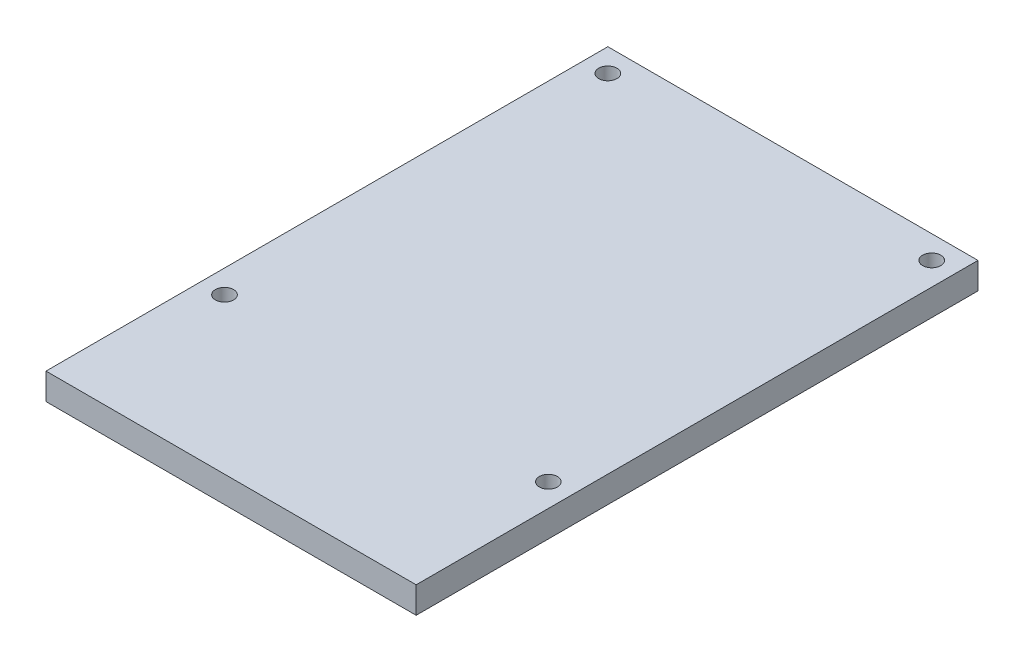
ISO-10303-21;
HEADER;
FILE_DESCRIPTION(('STEP AP214'),'2;1');
FILE_NAME('part.step','',(''),(''),'','','');
FILE_SCHEMA(('AUTOMOTIVE_DESIGN { 1 0 10303 214 1 1 1 1 }'));
ENDSEC;
DATA;
#1=APPLICATION_CONTEXT('core data for automotive mechanical design processes');
#2=APPLICATION_PROTOCOL_DEFINITION('international standard','automotive_design',2000,#1);
#3=PRODUCT_CONTEXT('',#1,'mechanical');
#4=PRODUCT('Part','Part','',(#3));
#5=PRODUCT_RELATED_PRODUCT_CATEGORY('part','',(#4));
#6=PRODUCT_DEFINITION_FORMATION('','',#4);
#7=PRODUCT_DEFINITION_CONTEXT('part definition',#1,'design');
#8=PRODUCT_DEFINITION('design','',#6,#7);
#9=PRODUCT_DEFINITION_SHAPE('','',#8);
#10=(LENGTH_UNIT() NAMED_UNIT(*) SI_UNIT(.MILLI.,.METRE.));
#11=(NAMED_UNIT(*) PLANE_ANGLE_UNIT() SI_UNIT($,.RADIAN.));
#12=(NAMED_UNIT(*) SI_UNIT($,.STERADIAN.) SOLID_ANGLE_UNIT());
#13=UNCERTAINTY_MEASURE_WITH_UNIT(LENGTH_MEASURE(1.E-05),#10,'distance_accuracy_value','');
#14=(GEOMETRIC_REPRESENTATION_CONTEXT(3) GLOBAL_UNCERTAINTY_ASSIGNED_CONTEXT((#13)) GLOBAL_UNIT_ASSIGNED_CONTEXT((#10,
#11,#12)) REPRESENTATION_CONTEXT('',''));
#15=CARTESIAN_POINT('',(0.,0.,0.));
#16=DIRECTION('',(0.,0.,1.));
#17=DIRECTION('',(1.,0.,0.));
#18=AXIS2_PLACEMENT_3D('',#15,#16,#17);
#19=CARTESIAN_POINT('',(0.,4.,0.));
#20=DIRECTION('',(1.,0.,0.));
#21=DIRECTION('',(0.,0.,-1.));
#22=AXIS2_PLACEMENT_3D('',#19,#20,#21);
#23=PLANE('',#22);
#24=DIRECTION('',(0.,0.,1.));
#25=VECTOR('',#24,1.);
#26=CARTESIAN_POINT('',(0.,0.,0.));
#27=LINE('',#26,#25);
#28=CARTESIAN_POINT('',(0.,0.,-85.));
#29=VERTEX_POINT('',#28);
#30=CARTESIAN_POINT('',(0.,0.,0.));
#31=VERTEX_POINT('',#30);
#32=EDGE_CURVE('E96',#29,#31,#27,.T.);
#33=ORIENTED_EDGE('',*,*,#32,.T.);
#34=DIRECTION('',(0.,-1.,0.));
#35=VECTOR('',#34,1.);
#36=CARTESIAN_POINT('',(0.,4.,0.));
#37=LINE('',#36,#35);
#38=CARTESIAN_POINT('',(0.,4.,0.));
#39=VERTEX_POINT('',#38);
#40=EDGE_CURVE('E11',#39,#31,#37,.T.);
#41=ORIENTED_EDGE('',*,*,#40,.F.);
#42=DIRECTION('',(0.,0.,1.));
#43=VECTOR('',#42,1.);
#44=CARTESIAN_POINT('',(0.,4.,0.));
#45=LINE('',#44,#43);
#46=CARTESIAN_POINT('',(0.,4.,-85.));
#47=VERTEX_POINT('',#46);
#48=EDGE_CURVE('E84',#47,#39,#45,.T.);
#49=ORIENTED_EDGE('',*,*,#48,.F.);
#50=DIRECTION('',(0.,-1.,0.));
#51=VECTOR('',#50,1.);
#52=CARTESIAN_POINT('',(0.,4.,-85.));
#53=LINE('',#52,#51);
#54=EDGE_CURVE('E92',#47,#29,#53,.T.);
#55=ORIENTED_EDGE('',*,*,#54,.T.);
#56=EDGE_LOOP('',(#33,#41,#49,#55));
#57=FACE_BOUND('',#56,.T.);
#58=ADVANCED_FACE('F33',(#57),#23,.F.);
#59=CARTESIAN_POINT('',(0.,4.,0.));
#60=DIRECTION('',(0.,0.,-1.));
#61=DIRECTION('',(-1.,0.,0.));
#62=AXIS2_PLACEMENT_3D('',#59,#60,#61);
#63=PLANE('',#62);
#64=DIRECTION('',(1.,0.,0.));
#65=VECTOR('',#64,1.);
#66=CARTESIAN_POINT('',(0.,0.,0.));
#67=LINE('',#66,#65);
#68=CARTESIAN_POINT('',(56.,0.,0.));
#69=VERTEX_POINT('',#68);
#70=EDGE_CURVE('E88',#31,#69,#67,.T.);
#71=ORIENTED_EDGE('',*,*,#70,.T.);
#72=DIRECTION('',(0.,-1.,0.));
#73=VECTOR('',#72,1.);
#74=CARTESIAN_POINT('',(56.,4.,0.));
#75=LINE('',#74,#73);
#76=CARTESIAN_POINT('',(56.,4.,0.));
#77=VERTEX_POINT('',#76);
#78=EDGE_CURVE('E41',#77,#69,#75,.T.);
#79=ORIENTED_EDGE('',*,*,#78,.F.);
#80=DIRECTION('',(1.,0.,0.));
#81=VECTOR('',#80,1.);
#82=CARTESIAN_POINT('',(0.,4.,0.));
#83=LINE('',#82,#81);
#84=EDGE_CURVE('E79',#39,#77,#83,.T.);
#85=ORIENTED_EDGE('',*,*,#84,.F.);
#86=ORIENTED_EDGE('',*,*,#40,.T.);
#87=EDGE_LOOP('',(#71,#79,#85,#86));
#88=FACE_BOUND('',#87,.T.);
#89=ADVANCED_FACE('F87',(#88),#63,.F.);
#90=CARTESIAN_POINT('',(56.,4.,0.));
#91=DIRECTION('',(-1.,0.,0.));
#92=DIRECTION('',(0.,0.,1.));
#93=AXIS2_PLACEMENT_3D('',#90,#91,#92);
#94=PLANE('',#93);
#95=DIRECTION('',(0.,0.,-1.));
#96=VECTOR('',#95,1.);
#97=CARTESIAN_POINT('',(56.,0.,0.));
#98=LINE('',#97,#96);
#99=CARTESIAN_POINT('',(56.,0.,-85.));
#100=VERTEX_POINT('',#99);
#101=EDGE_CURVE('E66',#69,#100,#98,.T.);
#102=ORIENTED_EDGE('',*,*,#101,.T.);
#103=DIRECTION('',(0.,-1.,0.));
#104=VECTOR('',#103,1.);
#105=CARTESIAN_POINT('',(56.,4.,-85.));
#106=LINE('',#105,#104);
#107=CARTESIAN_POINT('',(56.,4.,-85.));
#108=VERTEX_POINT('',#107);
#109=EDGE_CURVE('E89',#108,#100,#106,.T.);
#110=ORIENTED_EDGE('',*,*,#109,.F.);
#111=DIRECTION('',(0.,0.,-1.));
#112=VECTOR('',#111,1.);
#113=CARTESIAN_POINT('',(56.,4.,0.));
#114=LINE('',#113,#112);
#115=EDGE_CURVE('E82',#77,#108,#114,.T.);
#116=ORIENTED_EDGE('',*,*,#115,.F.);
#117=ORIENTED_EDGE('',*,*,#78,.T.);
#118=EDGE_LOOP('',(#102,#110,#116,#117));
#119=FACE_BOUND('',#118,.T.);
#120=ADVANCED_FACE('F90',(#119),#94,.F.);
#121=CARTESIAN_POINT('',(0.,4.,-85.));
#122=DIRECTION('',(0.,0.,1.));
#123=DIRECTION('',(1.,0.,0.));
#124=AXIS2_PLACEMENT_3D('',#121,#122,#123);
#125=PLANE('',#124);
#126=DIRECTION('',(-1.,0.,0.));
#127=VECTOR('',#126,1.);
#128=CARTESIAN_POINT('',(0.,0.,-85.));
#129=LINE('',#128,#127);
#130=EDGE_CURVE('E72',#100,#29,#129,.T.);
#131=ORIENTED_EDGE('',*,*,#130,.T.);
#132=ORIENTED_EDGE('',*,*,#54,.F.);
#133=DIRECTION('',(-1.,0.,0.));
#134=VECTOR('',#133,1.);
#135=CARTESIAN_POINT('',(0.,4.,-85.));
#136=LINE('',#135,#134);
#137=EDGE_CURVE('E49',#108,#47,#136,.T.);
#138=ORIENTED_EDGE('',*,*,#137,.F.);
#139=ORIENTED_EDGE('',*,*,#109,.T.);
#140=EDGE_LOOP('',(#131,#132,#138,#139));
#141=FACE_BOUND('',#140,.T.);
#142=ADVANCED_FACE('F104',(#141),#125,.F.);
#143=CARTESIAN_POINT('',(0.,4.,0.));
#144=DIRECTION('',(0.,-1.,0.));
#145=DIRECTION('',(0.,0.,-1.));
#146=AXIS2_PLACEMENT_3D('',#143,#144,#145);
#147=PLANE('',#146);
#148=CARTESIAN_POINT('',(52.5,4.,-81.5));
#149=DIRECTION('',(0.,1.,0.));
#150=DIRECTION('',(0.,0.,1.));
#151=AXIS2_PLACEMENT_3D('',#148,#149,#150);
#152=CIRCLE('',#151,1.375);
#153=CARTESIAN_POINT('',(52.5,4.,-80.125));
#154=VERTEX_POINT('',#153);
#155=EDGE_CURVE('E123',#154,#154,#152,.T.);
#156=ORIENTED_EDGE('',*,*,#155,.F.);
#157=EDGE_LOOP('',(#156));
#158=FACE_BOUND('',#157,.T.);
#159=CARTESIAN_POINT('',(3.5,4.,-23.5));
#160=DIRECTION('',(0.,1.,0.));
#161=DIRECTION('',(0.,0.,1.));
#162=AXIS2_PLACEMENT_3D('',#159,#160,#161);
#163=CIRCLE('',#162,1.375);
#164=CARTESIAN_POINT('',(3.5,4.,-22.125));
#165=VERTEX_POINT('',#164);
#166=EDGE_CURVE('E116',#165,#165,#163,.T.);
#167=ORIENTED_EDGE('',*,*,#166,.F.);
#168=EDGE_LOOP('',(#167));
#169=FACE_BOUND('',#168,.T.);
#170=CARTESIAN_POINT('',(52.5,4.,-23.5));
#171=DIRECTION('',(0.,1.,0.));
#172=DIRECTION('',(0.,0.,1.));
#173=AXIS2_PLACEMENT_3D('',#170,#171,#172);
#174=CIRCLE('',#173,1.375);
#175=CARTESIAN_POINT('',(52.5,4.,-22.125));
#176=VERTEX_POINT('',#175);
#177=EDGE_CURVE('E128',#176,#176,#174,.T.);
#178=ORIENTED_EDGE('',*,*,#177,.F.);
#179=EDGE_LOOP('',(#178));
#180=FACE_BOUND('',#179,.T.);
#181=CARTESIAN_POINT('',(3.5,4.,-81.5));
#182=DIRECTION('',(0.,1.,0.));
#183=DIRECTION('',(0.,0.,1.));
#184=AXIS2_PLACEMENT_3D('',#181,#182,#183);
#185=CIRCLE('',#184,1.375);
#186=CARTESIAN_POINT('',(3.5,4.,-80.125));
#187=VERTEX_POINT('',#186);
#188=EDGE_CURVE('E110',#187,#187,#185,.T.);
#189=ORIENTED_EDGE('',*,*,#188,.F.);
#190=EDGE_LOOP('',(#189));
#191=FACE_BOUND('',#190,.T.);
#192=ORIENTED_EDGE('',*,*,#48,.T.);
#193=ORIENTED_EDGE('',*,*,#84,.T.);
#194=ORIENTED_EDGE('',*,*,#115,.T.);
#195=ORIENTED_EDGE('',*,*,#137,.T.);
#196=EDGE_LOOP('',(#192,#193,#194,#195));
#197=FACE_BOUND('',#196,.T.);
#198=ADVANCED_FACE('F80',(#158,#169,#180,#191,#197),#147,.F.);
#199=CARTESIAN_POINT('',(0.,0.,0.));
#200=DIRECTION('',(0.,-1.,0.));
#201=DIRECTION('',(0.,0.,-1.));
#202=AXIS2_PLACEMENT_3D('',#199,#200,#201);
#203=PLANE('',#202);
#204=CARTESIAN_POINT('',(52.5,0.,-81.5));
#205=DIRECTION('',(0.,1.,0.));
#206=DIRECTION('',(0.,0.,1.));
#207=AXIS2_PLACEMENT_3D('',#204,#205,#206);
#208=CIRCLE('',#207,1.375);
#209=CARTESIAN_POINT('',(52.5,0.,-80.125));
#210=VERTEX_POINT('',#209);
#211=EDGE_CURVE('E113',#210,#210,#208,.T.);
#212=ORIENTED_EDGE('',*,*,#211,.T.);
#213=EDGE_LOOP('',(#212));
#214=FACE_BOUND('',#213,.T.);
#215=CARTESIAN_POINT('',(3.5,0.,-23.5));
#216=DIRECTION('',(0.,1.,0.));
#217=DIRECTION('',(0.,0.,1.));
#218=AXIS2_PLACEMENT_3D('',#215,#216,#217);
#219=CIRCLE('',#218,1.375);
#220=CARTESIAN_POINT('',(3.5,0.,-22.125));
#221=VERTEX_POINT('',#220);
#222=EDGE_CURVE('E119',#221,#221,#219,.T.);
#223=ORIENTED_EDGE('',*,*,#222,.T.);
#224=EDGE_LOOP('',(#223));
#225=FACE_BOUND('',#224,.T.);
#226=CARTESIAN_POINT('',(52.5,0.,-23.5));
#227=DIRECTION('',(0.,1.,0.));
#228=DIRECTION('',(0.,0.,1.));
#229=AXIS2_PLACEMENT_3D('',#226,#227,#228);
#230=CIRCLE('',#229,1.375);
#231=CARTESIAN_POINT('',(52.5,0.,-22.125));
#232=VERTEX_POINT('',#231);
#233=EDGE_CURVE('E120',#232,#232,#230,.T.);
#234=ORIENTED_EDGE('',*,*,#233,.T.);
#235=EDGE_LOOP('',(#234));
#236=FACE_BOUND('',#235,.T.);
#237=CARTESIAN_POINT('',(3.5,0.,-81.5));
#238=DIRECTION('',(0.,1.,0.));
#239=DIRECTION('',(0.,0.,1.));
#240=AXIS2_PLACEMENT_3D('',#237,#238,#239);
#241=CIRCLE('',#240,1.375);
#242=CARTESIAN_POINT('',(3.5,0.,-80.125));
#243=VERTEX_POINT('',#242);
#244=EDGE_CURVE('E99',#243,#243,#241,.T.);
#245=ORIENTED_EDGE('',*,*,#244,.T.);
#246=EDGE_LOOP('',(#245));
#247=FACE_BOUND('',#246,.T.);
#248=ORIENTED_EDGE('',*,*,#32,.F.);
#249=ORIENTED_EDGE('',*,*,#130,.F.);
#250=ORIENTED_EDGE('',*,*,#101,.F.);
#251=ORIENTED_EDGE('',*,*,#70,.F.);
#252=EDGE_LOOP('',(#248,#249,#250,#251));
#253=FACE_BOUND('',#252,.T.);
#254=ADVANCED_FACE('F107',(#214,#225,#236,#247,#253),#203,.T.);
#255=CARTESIAN_POINT('',(3.5,0.,-81.5));
#256=DIRECTION('',(0.,1.,0.));
#257=DIRECTION('',(0.,0.,1.));
#258=AXIS2_PLACEMENT_3D('',#255,#256,#257);
#259=CYLINDRICAL_SURFACE('',#258,1.375);
#260=ORIENTED_EDGE('',*,*,#244,.F.);
#261=EDGE_LOOP('',(#260));
#262=FACE_BOUND('',#261,.T.);
#263=ORIENTED_EDGE('',*,*,#188,.T.);
#264=EDGE_LOOP('',(#263));
#265=FACE_BOUND('',#264,.T.);
#266=ADVANCED_FACE('F140',(#262,#265),#259,.F.);
#267=CARTESIAN_POINT('',(52.5,0.,-23.5));
#268=DIRECTION('',(0.,1.,0.));
#269=DIRECTION('',(0.,0.,1.));
#270=AXIS2_PLACEMENT_3D('',#267,#268,#269);
#271=CYLINDRICAL_SURFACE('',#270,1.375);
#272=ORIENTED_EDGE('',*,*,#233,.F.);
#273=EDGE_LOOP('',(#272));
#274=FACE_BOUND('',#273,.T.);
#275=ORIENTED_EDGE('',*,*,#177,.T.);
#276=EDGE_LOOP('',(#275));
#277=FACE_BOUND('',#276,.T.);
#278=ADVANCED_FACE('F136',(#274,#277),#271,.F.);
#279=CARTESIAN_POINT('',(3.5,0.,-23.5));
#280=DIRECTION('',(0.,1.,0.));
#281=DIRECTION('',(0.,0.,1.));
#282=AXIS2_PLACEMENT_3D('',#279,#280,#281);
#283=CYLINDRICAL_SURFACE('',#282,1.375);
#284=ORIENTED_EDGE('',*,*,#222,.F.);
#285=EDGE_LOOP('',(#284));
#286=FACE_BOUND('',#285,.T.);
#287=ORIENTED_EDGE('',*,*,#166,.T.);
#288=EDGE_LOOP('',(#287));
#289=FACE_BOUND('',#288,.T.);
#290=ADVANCED_FACE('F139',(#286,#289),#283,.F.);
#291=CARTESIAN_POINT('',(52.5,0.,-81.5));
#292=DIRECTION('',(0.,1.,0.));
#293=DIRECTION('',(0.,0.,1.));
#294=AXIS2_PLACEMENT_3D('',#291,#292,#293);
#295=CYLINDRICAL_SURFACE('',#294,1.375);
#296=ORIENTED_EDGE('',*,*,#211,.F.);
#297=EDGE_LOOP('',(#296));
#298=FACE_BOUND('',#297,.T.);
#299=ORIENTED_EDGE('',*,*,#155,.T.);
#300=EDGE_LOOP('',(#299));
#301=FACE_BOUND('',#300,.T.);
#302=ADVANCED_FACE('F201',(#298,#301),#295,.F.);
#303=CLOSED_SHELL('',(#58,#89,#120,#142,#198,#254,#266,#278,#290,#302));
#304=MANIFOLD_SOLID_BREP('B2',#303);
#305=ADVANCED_BREP_SHAPE_REPRESENTATION('',(#18,#304),#14);
#306=SHAPE_DEFINITION_REPRESENTATION(#9,#305);
ENDSEC;
END-ISO-10303-21;
